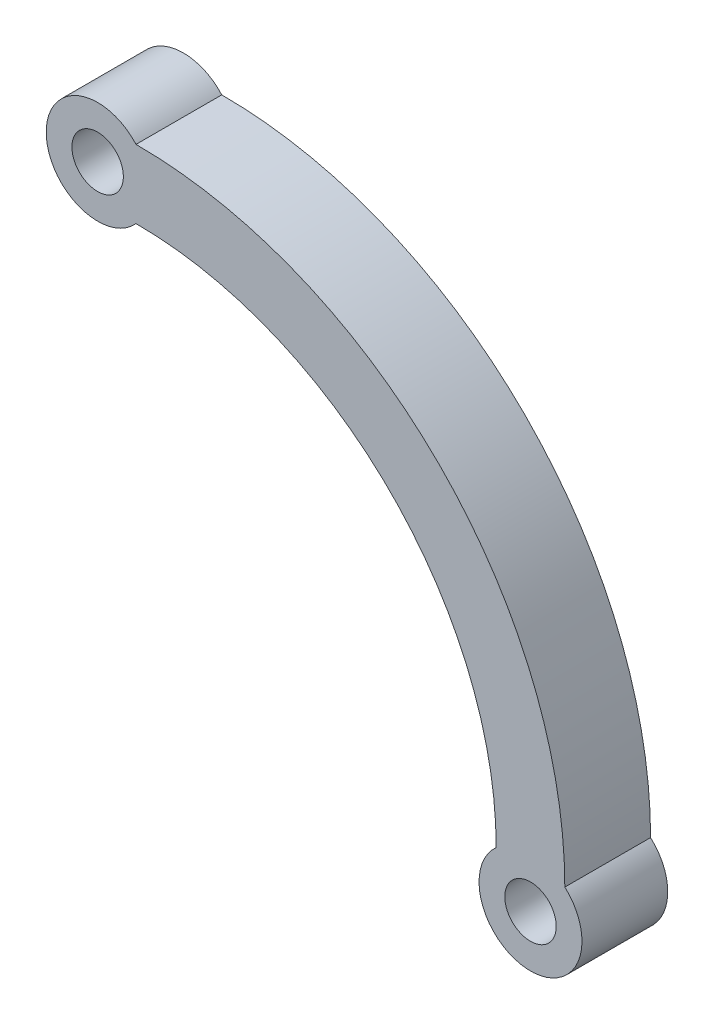
ISO-10303-21;
HEADER;
FILE_DESCRIPTION(('STEP AP214'),'2;1');
FILE_NAME('part.step','',(''),(''),'','','');
FILE_SCHEMA(('AUTOMOTIVE_DESIGN { 1 0 10303 214 1 1 1 1 }'));
ENDSEC;
DATA;
#1=APPLICATION_CONTEXT('core data for automotive mechanical design processes');
#2=APPLICATION_PROTOCOL_DEFINITION('international standard','automotive_design',2000,#1);
#3=PRODUCT_CONTEXT('',#1,'mechanical');
#4=PRODUCT('Part','Part','',(#3));
#5=PRODUCT_RELATED_PRODUCT_CATEGORY('part','',(#4));
#6=PRODUCT_DEFINITION_FORMATION('','',#4);
#7=PRODUCT_DEFINITION_CONTEXT('part definition',#1,'design');
#8=PRODUCT_DEFINITION('design','',#6,#7);
#9=PRODUCT_DEFINITION_SHAPE('','',#8);
#10=(LENGTH_UNIT() NAMED_UNIT(*) SI_UNIT(.MILLI.,.METRE.));
#11=(NAMED_UNIT(*) PLANE_ANGLE_UNIT() SI_UNIT($,.RADIAN.));
#12=(NAMED_UNIT(*) SI_UNIT($,.STERADIAN.) SOLID_ANGLE_UNIT());
#13=UNCERTAINTY_MEASURE_WITH_UNIT(LENGTH_MEASURE(1.E-05),#10,'distance_accuracy_value','');
#14=(GEOMETRIC_REPRESENTATION_CONTEXT(3) GLOBAL_UNCERTAINTY_ASSIGNED_CONTEXT((#13)) GLOBAL_UNIT_ASSIGNED_CONTEXT((#10,
#11,#12)) REPRESENTATION_CONTEXT('',''));
#15=CARTESIAN_POINT('',(0.,0.,0.));
#16=DIRECTION('',(0.,0.,1.));
#17=DIRECTION('',(1.,0.,0.));
#18=AXIS2_PLACEMENT_3D('',#15,#16,#17);
#19=CARTESIAN_POINT('',(0.,0.,10.));
#20=DIRECTION('',(0.,0.,-1.));
#21=DIRECTION('',(-1.,0.,0.));
#22=AXIS2_PLACEMENT_3D('',#19,#20,#21);
#23=CYLINDRICAL_SURFACE('',#22,42.);
#24=CARTESIAN_POINT('',(0.,0.,0.));
#25=DIRECTION('',(0.,0.,-1.));
#26=DIRECTION('',(1.,0.,0.));
#27=AXIS2_PLACEMENT_3D('',#24,#25,#26);
#28=CIRCLE('',#27,42.);
#29=CARTESIAN_POINT('',(0.,42.,0.));
#30=VERTEX_POINT('',#29);
#31=CARTESIAN_POINT('',(42.,0.,0.));
#32=VERTEX_POINT('',#31);
#33=EDGE_CURVE('E61',#30,#32,#28,.T.);
#34=ORIENTED_EDGE('',*,*,#33,.T.);
#35=DIRECTION('',(0.,0.,-1.));
#36=VECTOR('',#35,1.);
#37=CARTESIAN_POINT('',(42.,0.,10.));
#38=LINE('',#37,#36);
#39=CARTESIAN_POINT('',(42.,0.,10.));
#40=VERTEX_POINT('',#39);
#41=EDGE_CURVE('E11',#40,#32,#38,.T.);
#42=ORIENTED_EDGE('',*,*,#41,.F.);
#43=CARTESIAN_POINT('',(0.,0.,10.));
#44=DIRECTION('',(0.,0.,-1.));
#45=DIRECTION('',(1.,0.,0.));
#46=AXIS2_PLACEMENT_3D('',#43,#44,#45);
#47=CIRCLE('',#46,42.);
#48=CARTESIAN_POINT('',(0.,42.,10.));
#49=VERTEX_POINT('',#48);
#50=EDGE_CURVE('E51',#49,#40,#47,.T.);
#51=ORIENTED_EDGE('',*,*,#50,.F.);
#52=DIRECTION('',(0.,0.,-1.));
#53=VECTOR('',#52,1.);
#54=CARTESIAN_POINT('',(0.,42.,10.));
#55=LINE('',#54,#53);
#56=EDGE_CURVE('E86',#49,#30,#55,.T.);
#57=ORIENTED_EDGE('',*,*,#56,.T.);
#58=EDGE_LOOP('',(#34,#42,#51,#57));
#59=FACE_BOUND('',#58,.T.);
#60=ADVANCED_FACE('F35',(#59),#23,.F.);
#61=CARTESIAN_POINT('',(0.,0.,10.));
#62=DIRECTION('',(0.,0.,-1.));
#63=DIRECTION('',(-1.,0.,0.));
#64=AXIS2_PLACEMENT_3D('',#61,#62,#63);
#65=CYLINDRICAL_SURFACE('',#64,50.);
#66=CARTESIAN_POINT('',(0.,0.,0.));
#67=DIRECTION('',(0.,0.,1.));
#68=DIRECTION('',(1.,0.,0.));
#69=AXIS2_PLACEMENT_3D('',#66,#67,#68);
#70=CIRCLE('',#69,50.);
#71=CARTESIAN_POINT('',(50.,-1.87350135405495E-13,0.));
#72=VERTEX_POINT('',#71);
#73=CARTESIAN_POINT('',(0.,50.,0.));
#74=VERTEX_POINT('',#73);
#75=EDGE_CURVE('E107',#72,#74,#70,.T.);
#76=ORIENTED_EDGE('',*,*,#75,.T.);
#77=DIRECTION('',(0.,0.,-1.));
#78=VECTOR('',#77,1.);
#79=CARTESIAN_POINT('',(0.,50.,10.));
#80=LINE('',#79,#78);
#81=CARTESIAN_POINT('',(0.,50.,10.));
#82=VERTEX_POINT('',#81);
#83=EDGE_CURVE('E81',#82,#74,#80,.T.);
#84=ORIENTED_EDGE('',*,*,#83,.F.);
#85=CARTESIAN_POINT('',(0.,0.,10.));
#86=DIRECTION('',(0.,0.,1.));
#87=DIRECTION('',(1.,0.,0.));
#88=AXIS2_PLACEMENT_3D('',#85,#86,#87);
#89=CIRCLE('',#88,50.);
#90=CARTESIAN_POINT('',(50.,0.,10.));
#91=VERTEX_POINT('',#90);
#92=EDGE_CURVE('E76',#91,#82,#89,.T.);
#93=ORIENTED_EDGE('',*,*,#92,.F.);
#94=DIRECTION('',(0.,0.,-1.));
#95=VECTOR('',#94,1.);
#96=CARTESIAN_POINT('',(50.,0.,10.));
#97=LINE('',#96,#95);
#98=EDGE_CURVE('E43',#91,#72,#97,.T.);
#99=ORIENTED_EDGE('',*,*,#98,.T.);
#100=EDGE_LOOP('',(#76,#84,#93,#99));
#101=FACE_BOUND('',#100,.T.);
#102=ADVANCED_FACE('F78',(#101),#65,.T.);
#103=CARTESIAN_POINT('',(0.,0.,10.));
#104=DIRECTION('',(0.,0.,1.));
#105=DIRECTION('',(1.,0.,0.));
#106=AXIS2_PLACEMENT_3D('',#103,#104,#105);
#107=PLANE('',#106);
#108=CARTESIAN_POINT('',(-4.47213595499958,46.,10.));
#109=DIRECTION('',(0.,0.,1.));
#110=DIRECTION('',(1.,0.,0.));
#111=AXIS2_PLACEMENT_3D('',#108,#109,#110);
#112=CIRCLE('',#111,3.);
#113=CARTESIAN_POINT('',(-1.47213595499958,46.,10.));
#114=VERTEX_POINT('',#113);
#115=EDGE_CURVE('E186',#114,#114,#112,.T.);
#116=ORIENTED_EDGE('',*,*,#115,.F.);
#117=EDGE_LOOP('',(#116));
#118=FACE_BOUND('',#117,.T.);
#119=CARTESIAN_POINT('',(46.,-4.47213595499957,10.));
#120=DIRECTION('',(0.,0.,1.));
#121=DIRECTION('',(1.,0.,0.));
#122=AXIS2_PLACEMENT_3D('',#119,#120,#121);
#123=CIRCLE('',#122,3.);
#124=CARTESIAN_POINT('',(49.,-4.47213595499957,10.));
#125=VERTEX_POINT('',#124);
#126=EDGE_CURVE('E99',#125,#125,#123,.T.);
#127=ORIENTED_EDGE('',*,*,#126,.F.);
#128=EDGE_LOOP('',(#127));
#129=FACE_BOUND('',#128,.T.);
#130=ORIENTED_EDGE('',*,*,#50,.T.);
#131=CARTESIAN_POINT('',(46.,-4.47213595499957,10.));
#132=DIRECTION('',(0.,0.,1.));
#133=DIRECTION('',(1.,0.,0.));
#134=AXIS2_PLACEMENT_3D('',#131,#132,#133);
#135=CIRCLE('',#134,5.99999999999992);
#136=EDGE_CURVE('E91',#40,#91,#135,.T.);
#137=ORIENTED_EDGE('',*,*,#136,.T.);
#138=ORIENTED_EDGE('',*,*,#92,.T.);
#139=CARTESIAN_POINT('',(-4.47213595499958,46.,10.));
#140=DIRECTION('',(0.,0.,1.));
#141=DIRECTION('',(-1.,0.,0.));
#142=AXIS2_PLACEMENT_3D('',#139,#140,#141);
#143=CIRCLE('',#142,5.99999999999993);
#144=EDGE_CURVE('E96',#82,#49,#143,.T.);
#145=ORIENTED_EDGE('',*,*,#144,.T.);
#146=EDGE_LOOP('',(#130,#137,#138,#145));
#147=FACE_BOUND('',#146,.T.);
#148=ADVANCED_FACE('F93',(#118,#129,#147),#107,.T.);
#149=CARTESIAN_POINT('',(0.,0.,0.));
#150=DIRECTION('',(0.,0.,1.));
#151=DIRECTION('',(1.,0.,0.));
#152=AXIS2_PLACEMENT_3D('',#149,#150,#151);
#153=PLANE('',#152);
#154=CARTESIAN_POINT('',(-4.47213595499958,46.,0.));
#155=DIRECTION('',(0.,0.,1.));
#156=DIRECTION('',(1.,0.,0.));
#157=AXIS2_PLACEMENT_3D('',#154,#155,#156);
#158=CIRCLE('',#157,3.);
#159=CARTESIAN_POINT('',(-1.47213595499958,46.,0.));
#160=VERTEX_POINT('',#159);
#161=EDGE_CURVE('E183',#160,#160,#158,.T.);
#162=ORIENTED_EDGE('',*,*,#161,.T.);
#163=EDGE_LOOP('',(#162));
#164=FACE_BOUND('',#163,.T.);
#165=CARTESIAN_POINT('',(46.,-4.47213595499957,0.));
#166=DIRECTION('',(0.,0.,1.));
#167=DIRECTION('',(1.,0.,0.));
#168=AXIS2_PLACEMENT_3D('',#165,#166,#167);
#169=CIRCLE('',#168,3.);
#170=CARTESIAN_POINT('',(49.,-4.47213595499957,0.));
#171=VERTEX_POINT('',#170);
#172=EDGE_CURVE('E94',#171,#171,#169,.T.);
#173=ORIENTED_EDGE('',*,*,#172,.T.);
#174=EDGE_LOOP('',(#173));
#175=FACE_BOUND('',#174,.T.);
#176=ORIENTED_EDGE('',*,*,#33,.F.);
#177=CARTESIAN_POINT('',(-4.47213595499958,46.,0.));
#178=DIRECTION('',(0.,0.,1.));
#179=DIRECTION('',(-1.,0.,0.));
#180=AXIS2_PLACEMENT_3D('',#177,#178,#179);
#181=CIRCLE('',#180,5.99999999999993);
#182=EDGE_CURVE('E103',#74,#30,#181,.T.);
#183=ORIENTED_EDGE('',*,*,#182,.F.);
#184=ORIENTED_EDGE('',*,*,#75,.F.);
#185=CARTESIAN_POINT('',(46.,-4.47213595499957,0.));
#186=DIRECTION('',(0.,0.,1.));
#187=DIRECTION('',(1.,0.,0.));
#188=AXIS2_PLACEMENT_3D('',#185,#186,#187);
#189=CIRCLE('',#188,5.99999999999992);
#190=EDGE_CURVE('E92',#32,#72,#189,.T.);
#191=ORIENTED_EDGE('',*,*,#190,.F.);
#192=EDGE_LOOP('',(#176,#183,#184,#191));
#193=FACE_BOUND('',#192,.T.);
#194=ADVANCED_FACE('F114',(#164,#175,#193),#153,.F.);
#195=CARTESIAN_POINT('',(-4.47213595499958,46.,0.));
#196=DIRECTION('',(0.,0.,1.));
#197=DIRECTION('',(1.,0.,0.));
#198=AXIS2_PLACEMENT_3D('',#195,#196,#197);
#199=CYLINDRICAL_SURFACE('',#198,5.99999999999993);
#200=ORIENTED_EDGE('',*,*,#144,.F.);
#201=ORIENTED_EDGE('',*,*,#83,.T.);
#202=ORIENTED_EDGE('',*,*,#182,.T.);
#203=ORIENTED_EDGE('',*,*,#56,.F.);
#204=EDGE_LOOP('',(#200,#201,#202,#203));
#205=FACE_BOUND('',#204,.T.);
#206=ADVANCED_FACE('F113',(#205),#199,.T.);
#207=CARTESIAN_POINT('',(46.,-4.47213595499957,0.));
#208=DIRECTION('',(0.,0.,1.));
#209=DIRECTION('',(1.,0.,0.));
#210=AXIS2_PLACEMENT_3D('',#207,#208,#209);
#211=CYLINDRICAL_SURFACE('',#210,5.99999999999992);
#212=ORIENTED_EDGE('',*,*,#136,.F.);
#213=ORIENTED_EDGE('',*,*,#41,.T.);
#214=ORIENTED_EDGE('',*,*,#190,.T.);
#215=ORIENTED_EDGE('',*,*,#98,.F.);
#216=EDGE_LOOP('',(#212,#213,#214,#215));
#217=FACE_BOUND('',#216,.T.);
#218=ADVANCED_FACE('F90',(#217),#211,.T.);
#219=CARTESIAN_POINT('',(46.,-4.47213595499957,0.));
#220=DIRECTION('',(0.,0.,1.));
#221=DIRECTION('',(1.,0.,0.));
#222=AXIS2_PLACEMENT_3D('',#219,#220,#221);
#223=CYLINDRICAL_SURFACE('',#222,3.);
#224=ORIENTED_EDGE('',*,*,#172,.F.);
#225=EDGE_LOOP('',(#224));
#226=FACE_BOUND('',#225,.T.);
#227=ORIENTED_EDGE('',*,*,#126,.T.);
#228=EDGE_LOOP('',(#227));
#229=FACE_BOUND('',#228,.T.);
#230=ADVANCED_FACE('F154',(#226,#229),#223,.F.);
#231=CARTESIAN_POINT('',(-4.47213595499958,46.,0.));
#232=DIRECTION('',(0.,0.,1.));
#233=DIRECTION('',(1.,0.,0.));
#234=AXIS2_PLACEMENT_3D('',#231,#232,#233);
#235=CYLINDRICAL_SURFACE('',#234,3.);
#236=ORIENTED_EDGE('',*,*,#161,.F.);
#237=EDGE_LOOP('',(#236));
#238=FACE_BOUND('',#237,.T.);
#239=ORIENTED_EDGE('',*,*,#115,.T.);
#240=EDGE_LOOP('',(#239));
#241=FACE_BOUND('',#240,.T.);
#242=ADVANCED_FACE('F159',(#238,#241),#235,.F.);
#243=CLOSED_SHELL('',(#60,#102,#148,#194,#206,#218,#230,#242));
#244=MANIFOLD_SOLID_BREP('B2',#243);
#245=ADVANCED_BREP_SHAPE_REPRESENTATION('',(#18,#244),#14);
#246=SHAPE_DEFINITION_REPRESENTATION(#9,#245);
ENDSEC;
END-ISO-10303-21;
